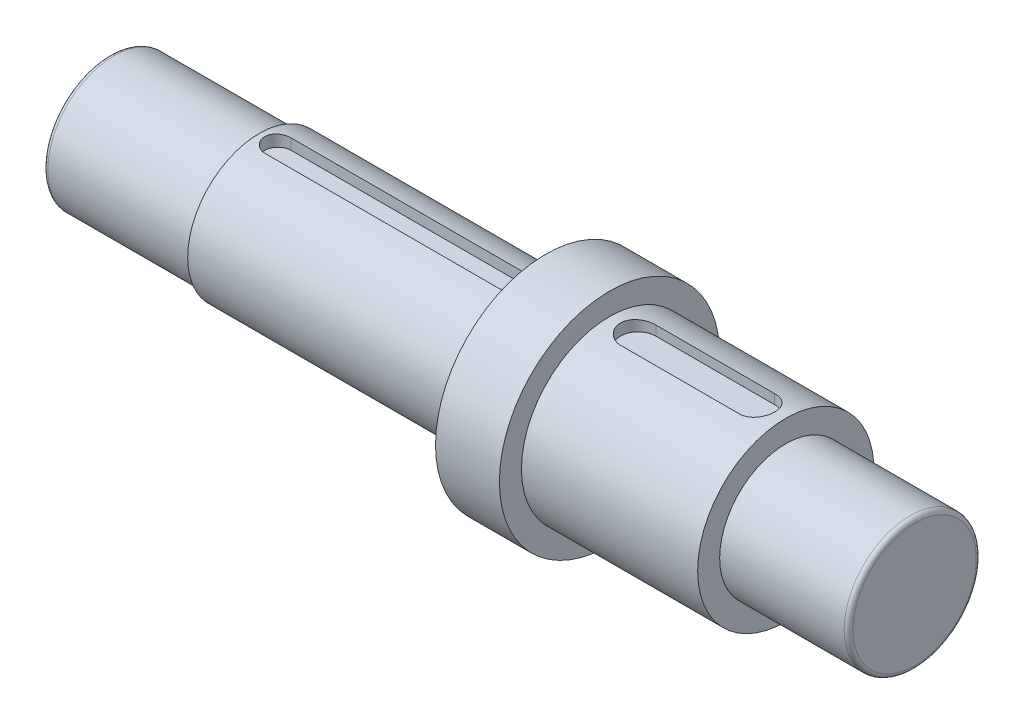
ISO-10303-21;
HEADER;
FILE_DESCRIPTION(('STEP AP214'),'2;1');
FILE_NAME('part.step','',(''),(''),'','','');
FILE_SCHEMA(('AUTOMOTIVE_DESIGN { 1 0 10303 214 1 1 1 1 }'));
ENDSEC;
DATA;
#1=APPLICATION_CONTEXT('core data for automotive mechanical design processes');
#2=APPLICATION_PROTOCOL_DEFINITION('international standard','automotive_design',2000,#1);
#3=PRODUCT_CONTEXT('',#1,'mechanical');
#4=PRODUCT('Part','Part','',(#3));
#5=PRODUCT_RELATED_PRODUCT_CATEGORY('part','',(#4));
#6=PRODUCT_DEFINITION_FORMATION('','',#4);
#7=PRODUCT_DEFINITION_CONTEXT('part definition',#1,'design');
#8=PRODUCT_DEFINITION('design','',#6,#7);
#9=PRODUCT_DEFINITION_SHAPE('','',#8);
#10=(LENGTH_UNIT() NAMED_UNIT(*) SI_UNIT(.MILLI.,.METRE.));
#11=(NAMED_UNIT(*) PLANE_ANGLE_UNIT() SI_UNIT($,.RADIAN.));
#12=(NAMED_UNIT(*) SI_UNIT($,.STERADIAN.) SOLID_ANGLE_UNIT());
#13=UNCERTAINTY_MEASURE_WITH_UNIT(LENGTH_MEASURE(1.E-05),#10,'distance_accuracy_value','');
#14=(GEOMETRIC_REPRESENTATION_CONTEXT(3) GLOBAL_UNCERTAINTY_ASSIGNED_CONTEXT((#13)) GLOBAL_UNIT_ASSIGNED_CONTEXT((#10,
#11,#12)) REPRESENTATION_CONTEXT('',''));
#15=CARTESIAN_POINT('',(0.,0.,0.));
#16=DIRECTION('',(0.,0.,1.));
#17=DIRECTION('',(1.,0.,0.));
#18=AXIS2_PLACEMENT_3D('',#15,#16,#17);
#19=CARTESIAN_POINT('',(-188.099626111809,0.,0.));
#20=DIRECTION('',(1.,0.,0.));
#21=DIRECTION('',(0.,0.,-1.));
#22=AXIS2_PLACEMENT_3D('',#19,#20,#21);
#23=PLANE('',#22);
#24=CARTESIAN_POINT('',(-188.099626111809,0.,0.));
#25=DIRECTION('',(1.,0.,0.));
#26=DIRECTION('',(0.,0.,-1.));
#27=AXIS2_PLACEMENT_3D('',#24,#25,#26);
#28=CIRCLE('',#27,28.);
#29=CARTESIAN_POINT('',(-188.099626111809,0.,-28.));
#30=VERTEX_POINT('',#29);
#31=EDGE_CURVE('E186',#30,#30,#28,.F.);
#32=ORIENTED_EDGE('',*,*,#31,.T.);
#33=EDGE_LOOP('',(#32));
#34=FACE_BOUND('',#33,.T.);
#35=ADVANCED_FACE('F37',(#34),#23,.F.);
#36=CARTESIAN_POINT('',(-188.099626111809,0.,0.));
#37=DIRECTION('',(-1.,0.,0.));
#38=DIRECTION('',(0.,0.,1.));
#39=AXIS2_PLACEMENT_3D('',#36,#37,#38);
#40=CYLINDRICAL_SURFACE('',#39,30.);
#41=CARTESIAN_POINT('',(-186.099626111809,0.,0.));
#42=DIRECTION('',(1.,0.,0.));
#43=DIRECTION('',(0.,0.,-1.));
#44=AXIS2_PLACEMENT_3D('',#41,#42,#43);
#45=CIRCLE('',#44,30.);
#46=CARTESIAN_POINT('',(-186.099626111809,0.,-30.));
#47=VERTEX_POINT('',#46);
#48=EDGE_CURVE('E189',#47,#47,#45,.T.);
#49=ORIENTED_EDGE('',*,*,#48,.T.);
#50=EDGE_LOOP('',(#49));
#51=FACE_BOUND('',#50,.T.);
#52=CARTESIAN_POINT('',(-120.099626111809,0.,0.));
#53=DIRECTION('',(-1.,0.,0.));
#54=DIRECTION('',(0.,0.,1.));
#55=AXIS2_PLACEMENT_3D('',#52,#53,#54);
#56=CIRCLE('',#55,30.);
#57=CARTESIAN_POINT('',(-120.099626111809,0.,30.));
#58=VERTEX_POINT('',#57);
#59=EDGE_CURVE('E177',#58,#58,#56,.T.);
#60=ORIENTED_EDGE('',*,*,#59,.T.);
#61=EDGE_LOOP('',(#60));
#62=FACE_BOUND('',#61,.T.);
#63=ADVANCED_FACE('F271',(#51,#62),#40,.T.);
#64=CARTESIAN_POINT('',(-120.099626111809,30.,0.));
#65=DIRECTION('',(1.,0.,0.));
#66=DIRECTION('',(0.,0.,-1.));
#67=AXIS2_PLACEMENT_3D('',#64,#65,#66);
#68=PLANE('',#67);
#69=ORIENTED_EDGE('',*,*,#59,.F.);
#70=EDGE_LOOP('',(#69));
#71=FACE_BOUND('',#70,.T.);
#72=CARTESIAN_POINT('',(-120.099626111809,0.,0.));
#73=DIRECTION('',(-1.,0.,0.));
#74=DIRECTION('',(0.,0.,1.));
#75=AXIS2_PLACEMENT_3D('',#72,#73,#74);
#76=CIRCLE('',#75,32.5);
#77=CARTESIAN_POINT('',(-120.099626111809,0.,32.5));
#78=VERTEX_POINT('',#77);
#79=EDGE_CURVE('E174',#78,#78,#76,.T.);
#80=ORIENTED_EDGE('',*,*,#79,.T.);
#81=EDGE_LOOP('',(#80));
#82=FACE_BOUND('',#81,.T.);
#83=ADVANCED_FACE('F277',(#71,#82),#68,.F.);
#84=CARTESIAN_POINT('',(-188.099626111809,0.,0.));
#85=DIRECTION('',(-1.,0.,0.));
#86=DIRECTION('',(0.,0.,1.));
#87=AXIS2_PLACEMENT_3D('',#84,#85,#86);
#88=CYLINDRICAL_SURFACE('',#87,32.5);
#89=DIRECTION('',(-1.,0.,0.));
#90=VECTOR('',#89,1.);
#91=CARTESIAN_POINT('',(-188.099626111809,31.9413525073689,-5.99999999999999));
#92=LINE('',#91,#90);
#93=CARTESIAN_POINT('',(-111.599626111809,31.9413525073689,-6.));
#94=VERTEX_POINT('',#93);
#95=CARTESIAN_POINT('',(1.40037388819075,31.9413525073689,-6.00000000000002));
#96=VERTEX_POINT('',#95);
#97=EDGE_CURVE('E457',#94,#96,#92,.F.);
#98=ORIENTED_EDGE('',*,*,#97,.T.);
#99=CARTESIAN_POINT('',(1.40037388819075,31.9413525073689,-6.00000000000002));
#100=CARTESIAN_POINT('',(1.56759213231855,31.9413387857947,-6.00001972804652));
#101=CARTESIAN_POINT('',(1.73480558941149,31.9426651643651,-5.99301037323591));
#102=CARTESIAN_POINT('',(2.06800747164038,31.947898574465,-5.96507748310398));
#103=CARTESIAN_POINT('',(2.23399603214048,31.951805316384,-5.94415550928303));
#104=CARTESIAN_POINT('',(2.56334009336544,31.9620927431616,-5.88858022552663));
#105=CARTESIAN_POINT('',(2.7266989541724,31.9684699578331,-5.85394617497413));
#106=CARTESIAN_POINT('',(3.04986439900829,31.9835079502799,-5.77122142179093));
#107=CARTESIAN_POINT('',(3.20967097733182,31.9921687317226,-5.72313069754892));
#108=CARTESIAN_POINT('',(3.52460885764031,32.0115239309396,-5.613858565212));
#109=CARTESIAN_POINT('',(3.67974033220621,32.0222182735384,-5.55267764101733));
#110=CARTESIAN_POINT('',(3.98432419858108,32.0453386476662,-5.41765280752468));
#111=CARTESIAN_POINT('',(4.13377446503129,32.0577653193071,-5.34380421506815));
#112=CARTESIAN_POINT('',(4.42587516859815,32.0839913654135,-5.18401841837622));
#113=CARTESIAN_POINT('',(4.56852780210195,32.0977902919789,-5.09808515477472));
#114=CARTESIAN_POINT('',(4.8461828974599,32.126383548917,-4.91468141870756));
#115=CARTESIAN_POINT('',(4.98118247998666,32.1411782494131,-4.81720664599407));
#116=CARTESIAN_POINT('',(5.24392898237313,32.1715045920759,-4.61035013215917));
#117=CARTESIAN_POINT('',(5.37158655490806,32.187042269054,-4.50085577213908));
#118=CARTESIAN_POINT('',(5.61729887855691,32.2182804790527,-4.27151002693492));
#119=CARTESIAN_POINT('',(5.73535005481028,32.2339810702705,-4.15165482004203));
#120=CARTESIAN_POINT('',(5.96096793099421,32.2650977553358,-3.90246404243752));
#121=CARTESIAN_POINT('',(6.06853684956549,32.280513908824,-3.7731304880801));
#122=CARTESIAN_POINT('',(6.27251215524249,32.3106414262999,-3.5057878707629));
#123=CARTESIAN_POINT('',(6.36891441281453,32.3253525283815,-3.36777562727));
#124=CARTESIAN_POINT('',(6.5504650990012,32.3537531221654,-3.08306099946315));
#125=CARTESIAN_POINT('',(6.63552987160601,32.3674347266048,-2.93630446341508));
#126=CARTESIAN_POINT('',(6.79300860896687,32.39327817288,-2.63595403307195));
#127=CARTESIAN_POINT('',(6.86541783889764,32.4054394454306,-2.48235760661727));
#128=CARTESIAN_POINT('',(6.99696891054346,32.4278842146267,-2.16953912880617));
#129=CARTESIAN_POINT('',(7.05611720991966,32.43816862479,-2.01031985951637));
#130=CARTESIAN_POINT('',(7.16075325084535,32.4565758245332,-1.68726622579658));
#131=CARTESIAN_POINT('',(7.20623603337107,32.4646978292852,-1.52343020954716));
#132=CARTESIAN_POINT('',(7.28271109315313,32.4784619635949,-1.19428937290305));
#133=CARTESIAN_POINT('',(7.31386333895041,32.4841314254946,-1.02902285551303));
#134=CARTESIAN_POINT('',(7.36219292388392,32.4929641670952,-0.696389660835734));
#135=CARTESIAN_POINT('',(7.37937013108371,32.4961274231355,-0.529022963736081));
#136=CARTESIAN_POINT('',(7.39961113282516,32.4998576642738,-0.193419088173538));
#137=CARTESIAN_POINT('',(7.40267573975347,32.5004247988165,-0.0251819603748304));
#138=CARTESIAN_POINT('',(7.39466906742151,32.4989470467579,0.310943540652038));
#139=CARTESIAN_POINT('',(7.38359787127174,32.4969021755137,0.478831915924853));
#140=CARTESIAN_POINT('',(7.34762918066929,32.4902991463823,0.811000792294008));
#141=CARTESIAN_POINT('',(7.32290155805706,32.4857718718836,0.975300336608155));
#142=CARTESIAN_POINT('',(7.25993171293172,32.4743508081301,1.30120167256646));
#143=CARTESIAN_POINT('',(7.22168972591755,32.4674570601131,1.46280351116897));
#144=CARTESIAN_POINT('',(7.13197359884245,32.4514913115269,1.7822145678949));
#145=CARTESIAN_POINT('',(7.08049682130815,32.4424188768056,1.94002302319778));
#146=CARTESIAN_POINT('',(6.96471953499474,32.422348706553,2.25067218859322));
#147=CARTESIAN_POINT('',(6.90042350877799,32.4113516441784,2.40351461351369));
#148=CARTESIAN_POINT('',(6.75905093295844,32.3876602669359,2.70413221736002));
#149=CARTESIAN_POINT('',(6.68190172408828,32.3749563872849,2.85187246890166));
#150=CARTESIAN_POINT('',(6.51567352140937,32.3482544525693,3.14028729035264));
#151=CARTESIAN_POINT('',(6.42659873164165,32.3342568541064,3.28096432628653));
#152=CARTESIAN_POINT('',(6.23708217455325,32.3053397564869,3.55442520770941));
#153=CARTESIAN_POINT('',(6.13663580163055,32.2904198849195,3.68720582162269));
#154=CARTESIAN_POINT('',(5.92513049171936,32.2600755738219,3.94388427294109));
#155=CARTESIAN_POINT('',(5.81407530010459,32.2446513136185,4.06778521841463));
#156=CARTESIAN_POINT('',(5.58031028946908,32.2134793446507,4.30773837389126));
#157=CARTESIAN_POINT('',(5.45744948638493,32.1977302742279,4.42364336885937));
#158=CARTESIAN_POINT('',(5.20241752114185,32.166590238664,4.64466655714655));
#159=CARTESIAN_POINT('',(5.07024973561523,32.1511991463148,4.74978862891943));
#160=CARTESIAN_POINT('',(4.79737578023074,32.1211958688334,4.94862562431094));
#161=CARTESIAN_POINT('',(4.65666403173227,32.1065842045684,5.04233297220689));
#162=CARTESIAN_POINT('',(4.36780189113093,32.0785750424357,5.21755652220306));
#163=CARTESIAN_POINT('',(4.21965434882862,32.0651770848488,5.29907734790027));
#164=CARTESIAN_POINT('',(3.9165076191391,32.0399447422428,5.44956701274568));
#165=CARTESIAN_POINT('',(3.76149178493203,32.0281144685451,5.51850301951116));
#166=CARTESIAN_POINT('',(3.44612020978507,32.0064110019808,5.64301783414206));
#167=CARTESIAN_POINT('',(3.28576657077875,31.996537049153,5.69860183057833));
#168=CARTESIAN_POINT('',(2.96098766453493,31.9790439211199,5.79596382074335));
#169=CARTESIAN_POINT('',(2.79656685590088,31.9714223859376,5.8377562699994));
#170=CARTESIAN_POINT('',(2.46475038653009,31.9586519303727,5.90726811971031));
#171=CARTESIAN_POINT('',(2.29735618621216,31.9535018291353,5.93499424144039));
#172=CARTESIAN_POINT('',(2.00814263464845,31.9469053541025,5.97038248093271));
#173=CARTESIAN_POINT('',(1.886748378074,31.9448246568417,5.98149459292175));
#174=CARTESIAN_POINT('',(1.64369783303153,31.9420477031673,5.99629903533954));
#175=CARTESIAN_POINT('',(1.52204232980331,31.9413491218277,6.00000382610285));
#176=CARTESIAN_POINT('',(1.40037388819075,31.9413525073689,5.99999999999998));
#177=B_SPLINE_CURVE_WITH_KNOTS('',3,(#99,#100,#101,#102,#103,#104,#105,#106,#107,#108,#109,#110,
#111,#112,#113,#114,#115,#116,#117,#118,#119,#120,#121,#122,#123,#124,#125,#126,#127,#128,#129,
#130,#131,#132,#133,#134,#135,#136,#137,#138,#139,#140,#141,#142,#143,#144,#145,#146,#147,#148,
#149,#150,#151,#152,#153,#154,#155,#156,#157,#158,#159,#160,#161,#162,#163,#164,#165,#166,#167,
#168,#169,#170,#171,#172,#173,#174,#175,#176),.UNSPECIFIED.,.F.,.F.,(4,2,2,2,2,2,2,2,2,2,2,2,2,
2,2,2,2,2,2,2,2,2,2,2,2,2,2,2,2,2,2,2,2,2,2,2,2,2,4),(0.,0.501495470760245,1.00293466504055,
1.50367204425039,2.00441022764532,2.50512990364768,3.00603509315042,3.50677732194079,
4.00770671273936,4.51381178473914,5.02010434213722,5.52628950547209,6.0326612671034,
6.54258387789152,7.05269685982357,7.56256089040486,8.07260972061949,8.57681791670595,
9.08103087289825,9.58521480389395,10.0893957705872,10.5874420693423,11.0854796896587,
11.5836166376146,12.0815797043902,12.5824597292727,13.0831636451031,13.5840710813185,
14.084802324456,14.5931139762335,15.1012421501453,15.6097057420663,16.1179759293311,
16.627553755771,17.1369332395351,17.6457771118129,18.1543776150577,18.5199145679153,
18.8848361083196),.UNSPECIFIED.);
#178=CARTESIAN_POINT('',(1.40037388819075,31.9413525073689,5.99999999999998));
#179=VERTEX_POINT('',#178);
#180=EDGE_CURVE('E192',#96,#179,#177,.T.);
#181=ORIENTED_EDGE('',*,*,#180,.T.);
#182=DIRECTION('',(-1.,0.,0.));
#183=VECTOR('',#182,1.);
#184=CARTESIAN_POINT('',(-188.099626111809,31.9413525073689,6.00000000000001));
#185=LINE('',#184,#183);
#186=CARTESIAN_POINT('',(-111.599626111809,31.9413525073689,6.00000000000001));
#187=VERTEX_POINT('',#186);
#188=EDGE_CURVE('E459',#179,#187,#185,.T.);
#189=ORIENTED_EDGE('',*,*,#188,.T.);
#190=CARTESIAN_POINT('',(-111.599626111809,31.9413525073689,6.));
#191=CARTESIAN_POINT('',(-111.766844355937,31.9413387857947,6.0000197280465));
#192=CARTESIAN_POINT('',(-111.93405781303,31.9426651643651,5.99301037323589));
#193=CARTESIAN_POINT('',(-112.267259695259,31.9478985744651,5.96507748310396));
#194=CARTESIAN_POINT('',(-112.433248255759,31.951805316384,5.94415550928301));
#195=CARTESIAN_POINT('',(-112.762592316984,31.9620927431616,5.88858022552661));
#196=CARTESIAN_POINT('',(-112.925951177791,31.9684699578331,5.85394617497411));
#197=CARTESIAN_POINT('',(-113.249116622627,31.9835079502799,5.77122142179091));
#198=CARTESIAN_POINT('',(-113.40892320095,31.9921687317226,5.72313069754889));
#199=CARTESIAN_POINT('',(-113.723861081259,32.0115239309396,5.61385856521198));
#200=CARTESIAN_POINT('',(-113.878992555825,32.0222182735384,5.55267764101731));
#201=CARTESIAN_POINT('',(-114.1835764222,32.0453386476662,5.41765280752466));
#202=CARTESIAN_POINT('',(-114.33302668865,32.0577653193071,5.34380421506813));
#203=CARTESIAN_POINT('',(-114.625127392217,32.0839913654135,5.18401841837619));
#204=CARTESIAN_POINT('',(-114.76778002572,32.0977902919789,5.0980851547747));
#205=CARTESIAN_POINT('',(-115.045435121078,32.126383548917,4.91468141870754));
#206=CARTESIAN_POINT('',(-115.180434703605,32.1411782494131,4.81720664599405));
#207=CARTESIAN_POINT('',(-115.443181205992,32.1715045920759,4.61035013215915));
#208=CARTESIAN_POINT('',(-115.570838778527,32.187042269054,4.50085577213906));
#209=CARTESIAN_POINT('',(-115.816551102175,32.2182804790527,4.2715100269349));
#210=CARTESIAN_POINT('',(-115.934602278429,32.2339810702705,4.15165482004201));
#211=CARTESIAN_POINT('',(-116.160220154613,32.2650977553358,3.9024640424375));
#212=CARTESIAN_POINT('',(-116.267789073184,32.280513908824,3.77313048808008));
#213=CARTESIAN_POINT('',(-116.471764378861,32.3106414262999,3.50578787076287));
#214=CARTESIAN_POINT('',(-116.568166636433,32.3253525283815,3.36777562726998));
#215=CARTESIAN_POINT('',(-116.74971732262,32.3537531221654,3.08306099946312));
#216=CARTESIAN_POINT('',(-116.834782095224,32.3674347266048,2.93630446341506));
#217=CARTESIAN_POINT('',(-116.992260832585,32.39327817288,2.63595403307193));
#218=CARTESIAN_POINT('',(-117.064670062516,32.4054394454306,2.48235760661725));
#219=CARTESIAN_POINT('',(-117.196221134162,32.4278842146267,2.16953912880615));
#220=CARTESIAN_POINT('',(-117.255369433538,32.43816862479,2.01031985951635));
#221=CARTESIAN_POINT('',(-117.360005474464,32.4565758245332,1.68726622579656));
#222=CARTESIAN_POINT('',(-117.40548825699,32.4646978292852,1.52343020954714));
#223=CARTESIAN_POINT('',(-117.481963316772,32.4784619635949,1.19428937290302));
#224=CARTESIAN_POINT('',(-117.513115562569,32.4841314254946,1.02902285551301));
#225=CARTESIAN_POINT('',(-117.561445147502,32.4929641670952,0.696389660835712));
#226=CARTESIAN_POINT('',(-117.578622354702,32.4961274231355,0.529022963736058));
#227=CARTESIAN_POINT('',(-117.598863356444,32.4998576642738,0.193419088173515));
#228=CARTESIAN_POINT('',(-117.601927963372,32.5004247988165,0.0251819603748068));
#229=CARTESIAN_POINT('',(-117.59392129104,32.4989470467579,-0.310943540652062));
#230=CARTESIAN_POINT('',(-117.58285009489,32.4969021755137,-0.478831915924877));
#231=CARTESIAN_POINT('',(-117.546881404288,32.4902991463823,-0.811000792294031));
#232=CARTESIAN_POINT('',(-117.522153781676,32.4857718718836,-0.975300336608177));
#233=CARTESIAN_POINT('',(-117.45918393655,32.4743508081301,-1.30120167256648));
#234=CARTESIAN_POINT('',(-117.420941949536,32.4674570601131,-1.46280351116899));
#235=CARTESIAN_POINT('',(-117.331225822461,32.4514913115269,-1.78221456789492));
#236=CARTESIAN_POINT('',(-117.279749044927,32.4424188768056,-1.9400230231978));
#237=CARTESIAN_POINT('',(-117.163971758613,32.422348706553,-2.25067218859324));
#238=CARTESIAN_POINT('',(-117.099675732396,32.4113516441784,-2.40351461351371));
#239=CARTESIAN_POINT('',(-116.958303156577,32.3876602669359,-2.70413221736004));
#240=CARTESIAN_POINT('',(-116.881153947707,32.3749563872849,-2.85187246890169));
#241=CARTESIAN_POINT('',(-116.714925745028,32.3482544525693,-3.14028729035266));
#242=CARTESIAN_POINT('',(-116.62585095526,32.3342568541064,-3.28096432628655));
#243=CARTESIAN_POINT('',(-116.436334398172,32.3053397564869,-3.55442520770944));
#244=CARTESIAN_POINT('',(-116.335888025249,32.2904198849195,-3.68720582162272));
#245=CARTESIAN_POINT('',(-116.124382715338,32.2600755738219,-3.94388427294112));
#246=CARTESIAN_POINT('',(-116.013327523723,32.2446513136185,-4.06778521841465));
#247=CARTESIAN_POINT('',(-115.779562513088,32.2134793446507,-4.30773837389129));
#248=CARTESIAN_POINT('',(-115.656701710003,32.1977302742279,-4.42364336885939));
#249=CARTESIAN_POINT('',(-115.40166974476,32.166590238664,-4.64466655714656));
#250=CARTESIAN_POINT('',(-115.269501959234,32.1511991463148,-4.74978862891945));
#251=CARTESIAN_POINT('',(-114.996628003849,32.1211958688334,-4.94862562431096));
#252=CARTESIAN_POINT('',(-114.855916255351,32.1065842045683,-5.04233297220692));
#253=CARTESIAN_POINT('',(-114.567054114749,32.0785750424357,-5.21755652220309));
#254=CARTESIAN_POINT('',(-114.418906572447,32.0651770848488,-5.29907734790029));
#255=CARTESIAN_POINT('',(-114.115759842758,32.0399447422428,-5.4495670127457));
#256=CARTESIAN_POINT('',(-113.960744008551,32.0281144685451,-5.51850301951117));
#257=CARTESIAN_POINT('',(-113.645372433404,32.0064110019808,-5.64301783414207));
#258=CARTESIAN_POINT('',(-113.485018794397,31.996537049153,-5.69860183057835));
#259=CARTESIAN_POINT('',(-113.160239888153,31.9790439211199,-5.79596382074337));
#260=CARTESIAN_POINT('',(-112.995819079519,31.9714223859376,-5.83775626999942));
#261=CARTESIAN_POINT('',(-112.664002610149,31.9586519303727,-5.90726811971033));
#262=CARTESIAN_POINT('',(-112.496608409831,31.9535018291353,-5.93499424144041));
#263=CARTESIAN_POINT('',(-112.207394858267,31.9469053541025,-5.97038248093273));
#264=CARTESIAN_POINT('',(-112.086000601692,31.9448246568417,-5.98149459292177));
#265=CARTESIAN_POINT('',(-111.84295005665,31.9420477031673,-5.99629903533957));
#266=CARTESIAN_POINT('',(-111.721294553422,31.9413491218277,-6.00000382610288));
#267=CARTESIAN_POINT('',(-111.599626111809,31.9413525073689,-6.));
#268=B_SPLINE_CURVE_WITH_KNOTS('',3,(#190,#191,#192,#193,#194,#195,#196,#197,#198,#199,#200,
#201,#202,#203,#204,#205,#206,#207,#208,#209,#210,#211,#212,#213,#214,#215,#216,#217,#218,#219,
#220,#221,#222,#223,#224,#225,#226,#227,#228,#229,#230,#231,#232,#233,#234,#235,#236,#237,#238,
#239,#240,#241,#242,#243,#244,#245,#246,#247,#248,#249,#250,#251,#252,#253,#254,#255,#256,#257,
#258,#259,#260,#261,#262,#263,#264,#265,#266,#267),.UNSPECIFIED.,.F.,.F.,(4,2,2,2,2,2,2,2,2,2,2,
2,2,2,2,2,2,2,2,2,2,2,2,2,2,2,2,2,2,2,2,2,2,2,2,2,2,2,4),(0.,0.501495470760242,1.00293466504055,
1.50367204425039,2.00441022764532,2.50512990364768,3.00603509315043,3.5067773219408,
4.00770671273937,4.51381178473914,5.02010434213723,5.52628950547209,6.03266126710341,
6.54258387789152,7.05269685982358,7.56256089040487,8.0726097206195,8.57681791670596,
9.08103087289826,9.58521480389396,10.0893957705872,10.5874420693423,11.0854796896587,
11.5836166376146,12.0815797043902,12.5824597292727,13.0831636451032,13.5840710813185,
14.084802324456,14.5931139762335,15.1012421501453,15.6097057420663,16.1179759293311,
16.627553755771,17.1369332395351,17.6457771118129,18.1543776150577,18.5199145679153,
18.8848361083197),.UNSPECIFIED.);
#269=EDGE_CURVE('E60',#187,#94,#268,.T.);
#270=ORIENTED_EDGE('',*,*,#269,.T.);
#271=EDGE_LOOP('',(#98,#181,#189,#270));
#272=FACE_BOUND('',#271,.T.);
#273=ORIENTED_EDGE('',*,*,#79,.F.);
#274=EDGE_LOOP('',(#273));
#275=FACE_BOUND('',#274,.T.);
#276=CARTESIAN_POINT('',(9.90037388819076,0.,0.));
#277=DIRECTION('',(-1.,0.,0.));
#278=DIRECTION('',(0.,0.,1.));
#279=AXIS2_PLACEMENT_3D('',#276,#277,#278);
#280=CIRCLE('',#279,32.5);
#281=CARTESIAN_POINT('',(9.90037388819076,0.,32.5));
#282=VERTEX_POINT('',#281);
#283=EDGE_CURVE('E171',#282,#282,#280,.T.);
#284=ORIENTED_EDGE('',*,*,#283,.T.);
#285=EDGE_LOOP('',(#284));
#286=FACE_BOUND('',#285,.T.);
#287=ADVANCED_FACE('F207',(#272,#275,#286),#88,.T.);
#288=CARTESIAN_POINT('',(9.90037388819076,32.5,0.));
#289=DIRECTION('',(1.,0.,0.));
#290=DIRECTION('',(0.,0.,-1.));
#291=AXIS2_PLACEMENT_3D('',#288,#289,#290);
#292=PLANE('',#291);
#293=ORIENTED_EDGE('',*,*,#283,.F.);
#294=EDGE_LOOP('',(#293));
#295=FACE_BOUND('',#294,.T.);
#296=CARTESIAN_POINT('',(9.90037388819076,0.,0.));
#297=DIRECTION('',(-1.,0.,0.));
#298=DIRECTION('',(0.,0.,1.));
#299=AXIS2_PLACEMENT_3D('',#296,#297,#298);
#300=CIRCLE('',#299,50.);
#301=CARTESIAN_POINT('',(9.90037388819076,0.,50.));
#302=VERTEX_POINT('',#301);
#303=EDGE_CURVE('E168',#302,#302,#300,.T.);
#304=ORIENTED_EDGE('',*,*,#303,.T.);
#305=EDGE_LOOP('',(#304));
#306=FACE_BOUND('',#305,.T.);
#307=ADVANCED_FACE('F306',(#295,#306),#292,.F.);
#308=CARTESIAN_POINT('',(-188.099626111809,0.,0.));
#309=DIRECTION('',(-1.,0.,0.));
#310=DIRECTION('',(0.,0.,1.));
#311=AXIS2_PLACEMENT_3D('',#308,#309,#310);
#312=CYLINDRICAL_SURFACE('',#311,50.);
#313=ORIENTED_EDGE('',*,*,#303,.F.);
#314=EDGE_LOOP('',(#313));
#315=FACE_BOUND('',#314,.T.);
#316=CARTESIAN_POINT('',(38.9003738881908,0.,0.));
#317=DIRECTION('',(-1.,0.,0.));
#318=DIRECTION('',(0.,0.,1.));
#319=AXIS2_PLACEMENT_3D('',#316,#317,#318);
#320=CIRCLE('',#319,50.);
#321=CARTESIAN_POINT('',(38.9003738881908,0.,50.));
#322=VERTEX_POINT('',#321);
#323=EDGE_CURVE('E165',#322,#322,#320,.T.);
#324=ORIENTED_EDGE('',*,*,#323,.T.);
#325=EDGE_LOOP('',(#324));
#326=FACE_BOUND('',#325,.T.);
#327=ADVANCED_FACE('F312',(#315,#326),#312,.T.);
#328=CARTESIAN_POINT('',(38.9003738881908,50.,0.));
#329=DIRECTION('',(-1.,0.,0.));
#330=DIRECTION('',(0.,0.,1.));
#331=AXIS2_PLACEMENT_3D('',#328,#329,#330);
#332=PLANE('',#331);
#333=ORIENTED_EDGE('',*,*,#323,.F.);
#334=EDGE_LOOP('',(#333));
#335=FACE_BOUND('',#334,.T.);
#336=CARTESIAN_POINT('',(38.9003738881908,0.,0.));
#337=DIRECTION('',(-1.,0.,0.));
#338=DIRECTION('',(0.,0.,1.));
#339=AXIS2_PLACEMENT_3D('',#336,#337,#338);
#340=CIRCLE('',#339,40.);
#341=CARTESIAN_POINT('',(38.9003738881908,0.,40.));
#342=VERTEX_POINT('',#341);
#343=EDGE_CURVE('E162',#342,#342,#340,.T.);
#344=ORIENTED_EDGE('',*,*,#343,.T.);
#345=EDGE_LOOP('',(#344));
#346=FACE_BOUND('',#345,.T.);
#347=ADVANCED_FACE('F244',(#335,#346),#332,.F.);
#348=CARTESIAN_POINT('',(-188.099626111809,0.,0.));
#349=DIRECTION('',(-1.,0.,0.));
#350=DIRECTION('',(0.,0.,1.));
#351=AXIS2_PLACEMENT_3D('',#348,#349,#350);
#352=CYLINDRICAL_SURFACE('',#351,40.);
#353=DIRECTION('',(-1.,0.,0.));
#354=VECTOR('',#353,1.);
#355=CARTESIAN_POINT('',(-188.099626111809,39.1918358845309,-7.99999999999996));
#356=LINE('',#355,#354);
#357=CARTESIAN_POINT('',(51.9003738881907,39.1918358845309,-8.00000000000001));
#358=VERTEX_POINT('',#357);
#359=CARTESIAN_POINT('',(105.900373888191,39.1918358845309,-8.00000000000002));
#360=VERTEX_POINT('',#359);
#361=EDGE_CURVE('E11',#358,#360,#356,.F.);
#362=ORIENTED_EDGE('',*,*,#361,.T.);
#363=CARTESIAN_POINT('',(105.900373888191,39.1918358845309,-8.00000000000002));
#364=CARTESIAN_POINT('',(106.122974410828,39.1918159431798,-8.00002666922674));
#365=CARTESIAN_POINT('',(106.345568032235,39.1937316873133,-7.9907103558701));
#366=CARTESIAN_POINT('',(106.789117637829,39.2012897767833,-7.95358673509779));
#367=CARTESIAN_POINT('',(107.010073821181,39.2069316611182,-7.92578171511934));
#368=CARTESIAN_POINT('',(107.448447184837,39.2217860307119,-7.8519317275118));
#369=CARTESIAN_POINT('',(107.665869233589,39.2309930760462,-7.80591454667944));
#370=CARTESIAN_POINT('',(108.095979336453,39.2527015332246,-7.69601051127466));
#371=CARTESIAN_POINT('',(108.308667371235,39.2652029585174,-7.63212358375313));
#372=CARTESIAN_POINT('',(108.72780662392,39.2931373309787,-7.4869759582795));
#373=CARTESIAN_POINT('',(108.934258426169,39.3085700024906,-7.40571689392717));
#374=CARTESIAN_POINT('',(109.339610412071,39.3419309258448,-7.2263951793695));
#375=CARTESIAN_POINT('',(109.538507768332,39.359860100561,-7.12832631202961));
#376=CARTESIAN_POINT('',(109.92728093049,39.3976973294659,-6.91614404681895));
#377=CARTESIAN_POINT('',(110.117159193655,39.4176048400293,-6.8020350530473));
#378=CARTESIAN_POINT('',(110.486761304225,39.4588545756894,-6.55850947337002));
#379=CARTESIAN_POINT('',(110.6664815319,39.4801973063558,-6.4290874809944));
#380=CARTESIAN_POINT('',(111.016674671152,39.5239924026978,-6.15415578885215));
#381=CARTESIAN_POINT('',(111.187005372329,39.5464552423725,-6.00846658612049));
#382=CARTESIAN_POINT('',(111.51483213444,39.5916124451561,-5.70333270732976));
#383=CARTESIAN_POINT('',(111.672328108516,39.6143068098307,-5.54388793819498));
#384=CARTESIAN_POINT('',(111.973466691381,39.6593025376984,-5.21226662634086));
#385=CARTESIAN_POINT('',(112.117104880146,39.6816037736592,-5.04008605219296));
#386=CARTESIAN_POINT('',(112.389437452669,39.7251794083479,-4.68425375547296));
#387=CARTESIAN_POINT('',(112.518136678581,39.7464541384827,-4.50060577967102));
#388=CARTESIAN_POINT('',(112.760815682899,39.7875762988249,-4.12134325254239));
#389=CARTESIAN_POINT('',(112.874654240406,39.8074093383913,-3.92563673340874));
#390=CARTESIAN_POINT('',(113.085411580005,39.8448742915997,-3.52511574724934));
#391=CARTESIAN_POINT('',(113.182330603902,39.8625062366975,-3.32030141044043));
#392=CARTESIAN_POINT('',(113.358504784034,39.8950650833093,-2.90302705629159));
#393=CARTESIAN_POINT('',(113.437761802143,39.9099922699196,-2.69056784759605));
#394=CARTESIAN_POINT('',(113.578001059155,39.9367151389395,-2.25951457252051));
#395=CARTESIAN_POINT('',(113.638983945792,39.948510932341,-2.04092072388624));
#396=CARTESIAN_POINT('',(113.741517513335,39.9685005509805,-1.60205660509414));
#397=CARTESIAN_POINT('',(113.783309955072,39.9767391064403,-1.38184484347664));
#398=CARTESIAN_POINT('',(113.848269063717,39.9895989229295,-0.938668501096538));
#399=CARTESIAN_POINT('',(113.871442672396,39.9942215320969,-0.715704977800327));
#400=CARTESIAN_POINT('',(113.899002944583,39.9997235457757,-0.268546453942596));
#401=CARTESIAN_POINT('',(113.903387327323,40.0006024958556,-0.0443513071851616));
#402=CARTESIAN_POINT('',(113.893326869244,39.9985908858011,0.403598136420499));
#403=CARTESIAN_POINT('',(113.878882175075,39.9957003550254,0.627352436688695));
#404=CARTESIAN_POINT('',(113.83162661832,39.9863007164749,1.06956087762929));
#405=CARTESIAN_POINT('',(113.79908413002,39.9798444941963,1.28804488719501));
#406=CARTESIAN_POINT('',(113.71606699332,39.9635259160648,1.72152774938214));
#407=CARTESIAN_POINT('',(113.665586125328,39.9536623788616,1.93652536613345));
#408=CARTESIAN_POINT('',(113.547103395042,39.9308038729487,2.36138711377733));
#409=CARTESIAN_POINT('',(113.479107359111,39.9178099456462,2.57125292637827));
#410=CARTESIAN_POINT('',(113.326071063526,39.8890377494063,2.98456033438453));
#411=CARTESIAN_POINT('',(113.241024781951,39.8732584969652,3.18799963056056));
#412=CARTESIAN_POINT('',(113.05395294381,39.839241787259,3.58823088504011));
#413=CARTESIAN_POINT('',(112.951826488758,39.8209898525272,3.7849744440591));
#414=CARTESIAN_POINT('',(112.731697190893,39.7825996820114,4.16917750443026));
#415=CARTESIAN_POINT('',(112.613694105933,39.762461417459,4.35663686412196));
#416=CARTESIAN_POINT('',(112.362608486233,39.7208402552587,4.72106963579888));
#417=CARTESIAN_POINT('',(112.229522696929,39.6993570678511,4.89804077202867));
#418=CARTESIAN_POINT('',(111.949241007284,39.6556382273803,5.24023924452891));
#419=CARTESIAN_POINT('',(111.802049410858,39.6334028051675,5.4054701363154));
#420=CARTESIAN_POINT('',(111.491806671275,39.5883841709058,5.72594829962103));
#421=CARTESIAN_POINT('',(111.32852301432,39.5655981831912,5.88097018343542));
#422=CARTESIAN_POINT('',(110.989439256982,39.52050553126,6.17673271835418));
#423=CARTESIAN_POINT('',(110.813639298877,39.4981988615986,6.31747353175152));
#424=CARTESIAN_POINT('',(110.450656030673,39.4546904604362,6.58373833819255));
#425=CARTESIAN_POINT('',(110.263469251054,39.4334890694003,6.70925765808143));
#426=CARTESIAN_POINT('',(109.879041254413,39.3928073388215,6.94413000109325));
#427=CARTESIAN_POINT('',(109.681800307801,39.3733269530302,7.05348345869363));
#428=CARTESIAN_POINT('',(109.278027519462,39.3365988941848,7.25551976501701));
#429=CARTESIAN_POINT('',(109.071470170284,39.319357923992,7.34815287597922));
#430=CARTESIAN_POINT('',(108.651140916193,39.287693064182,7.51561296401807));
#431=CARTESIAN_POINT('',(108.437371866988,39.2732680744914,7.59044689691487));
#432=CARTESIAN_POINT('',(108.004309491692,39.2476734918111,7.72169650413227));
#433=CARTESIAN_POINT('',(107.78502218219,39.2365005071337,7.77813137524139));
#434=CARTESIAN_POINT('',(107.342393842191,39.217732786038,7.8722129784336));
#435=CARTESIAN_POINT('',(107.119054791977,39.2101363480467,7.90986864539155));
#436=CARTESIAN_POINT('',(106.729559165192,39.200259679954,7.95864886653906));
#437=CARTESIAN_POINT('',(106.563960659121,39.1971035385051,7.97416273216955));
#438=CARTESIAN_POINT('',(106.232371119318,39.192890643088,7.99483261811853));
#439=CARTESIAN_POINT('',(106.066381210279,39.1918303757664,8.00000597259349));
#440=CARTESIAN_POINT('',(105.900373888191,39.1918358845309,8.));
#441=B_SPLINE_CURVE_WITH_KNOTS('',3,(#363,#364,#365,#366,#367,#368,#369,#370,#371,#372,#373,
#374,#375,#376,#377,#378,#379,#380,#381,#382,#383,#384,#385,#386,#387,#388,#389,#390,#391,#392,
#393,#394,#395,#396,#397,#398,#399,#400,#401,#402,#403,#404,#405,#406,#407,#408,#409,#410,#411,
#412,#413,#414,#415,#416,#417,#418,#419,#420,#421,#422,#423,#424,#425,#426,#427,#428,#429,#430,
#431,#432,#433,#434,#435,#436,#437,#438,#439,#440),.UNSPECIFIED.,.F.,.F.,(4,2,2,2,2,2,2,2,2,2,2,
2,2,2,2,2,2,2,2,2,2,2,2,2,2,2,2,2,2,2,2,2,2,2,2,2,2,2,4),(0.,0.667588082863367,1.33509358657229,
2.00158456075833,2.66807825577954,3.33450930419423,4.00118736722491,4.66768273830518,
5.33441413112674,6.00940860933878,6.68440765519395,7.35962128919453,8.03461545192921,
8.71561799719686,9.39661080912297,10.0775317988518,10.7584286501499,11.4304948903323,
12.1023104435849,12.7742075441763,13.4460994116818,14.1082836198391,14.7706976447377,
15.4328916036424,16.0953198539647,16.7618092594034,17.4283088311615,18.09495249579,
18.761393400153,19.439500080017,20.1175990528766,20.7959056848449,21.4741940831725,
22.1544680675849,22.8344757662839,23.5137716866303,24.1927440986814,24.6914848131909,
25.1893887678566),.UNSPECIFIED.);
#442=CARTESIAN_POINT('',(105.900373888191,39.1918358845308,8.));
#443=VERTEX_POINT('',#442);
#444=EDGE_CURVE('E249',#360,#443,#441,.T.);
#445=ORIENTED_EDGE('',*,*,#444,.T.);
#446=DIRECTION('',(-1.,0.,0.));
#447=VECTOR('',#446,1.);
#448=CARTESIAN_POINT('',(-188.099626111809,39.1918358845308,8.00000000000006));
#449=LINE('',#448,#447);
#450=CARTESIAN_POINT('',(51.9003738881907,39.1918358845308,8.00000000000006));
#451=VERTEX_POINT('',#450);
#452=EDGE_CURVE('E45',#443,#451,#449,.T.);
#453=ORIENTED_EDGE('',*,*,#452,.T.);
#454=CARTESIAN_POINT('',(51.9003738881907,39.1918358845309,8.00000000000001));
#455=CARTESIAN_POINT('',(51.6777733655539,39.1918159431797,8.00002666922673));
#456=CARTESIAN_POINT('',(51.4551797441462,39.1937316873133,7.99071035587009));
#457=CARTESIAN_POINT('',(51.0116301385526,39.2012897767833,7.95358673509778));
#458=CARTESIAN_POINT('',(50.7906739552005,39.2069316611182,7.92578171511933));
#459=CARTESIAN_POINT('',(50.3523005915448,39.2217860307119,7.85193172751178));
#460=CARTESIAN_POINT('',(50.1348785427924,39.2309930760462,7.80591454667943));
#461=CARTESIAN_POINT('',(49.7047684399284,39.2527015332246,7.69601051127465));
#462=CARTESIAN_POINT('',(49.4920804051461,39.2652029585174,7.63212358375312));
#463=CARTESIAN_POINT('',(49.0729411524612,39.2931373309787,7.48697595827949));
#464=CARTESIAN_POINT('',(48.8664893502125,39.3085700024906,7.40571689392716));
#465=CARTESIAN_POINT('',(48.4611373643103,39.3419309258448,7.2263951793695));
#466=CARTESIAN_POINT('',(48.2622400080494,39.359860100561,7.1283263120296));
#467=CARTESIAN_POINT('',(47.8734668458918,39.3976973294659,6.91614404681895));
#468=CARTESIAN_POINT('',(47.6835885827265,39.4176048400293,6.8020350530473));
#469=CARTESIAN_POINT('',(47.3139864721564,39.4588545756894,6.55850947337001));
#470=CARTESIAN_POINT('',(47.1342662444813,39.4801973063558,6.42908748099439));
#471=CARTESIAN_POINT('',(46.7840731052291,39.5239924026978,6.15415578885214));
#472=CARTESIAN_POINT('',(46.6137424040529,39.5464552423725,6.00846658612048));
#473=CARTESIAN_POINT('',(46.2859156419415,39.5916124451561,5.70333270732975));
#474=CARTESIAN_POINT('',(46.1284196678654,39.6143068098307,5.54388793819497));
#475=CARTESIAN_POINT('',(45.827281085,39.6593025376984,5.21226662634085));
#476=CARTESIAN_POINT('',(45.6836428962353,39.6816037736592,5.04008605219294));
#477=CARTESIAN_POINT('',(45.4113103237129,39.7251794083479,4.68425375547294));
#478=CARTESIAN_POINT('',(45.2826110978002,39.7464541384827,4.500605779671));
#479=CARTESIAN_POINT('',(45.0399320934821,39.7875762988249,4.12134325254238));
#480=CARTESIAN_POINT('',(44.926093535975,39.8074093383913,3.92563673340873));
#481=CARTESIAN_POINT('',(44.7153361963764,39.8448742915997,3.52511574724933));
#482=CARTESIAN_POINT('',(44.6184171724793,39.8625062366975,3.32030141044042));
#483=CARTESIAN_POINT('',(44.4422429923478,39.8950650833092,2.90302705629158));
#484=CARTESIAN_POINT('',(44.3629859742381,39.9099922699196,2.69056784759604));
#485=CARTESIAN_POINT('',(44.2227467172268,39.9367151389395,2.2595145725205));
#486=CARTESIAN_POINT('',(44.1617638305896,39.948510932341,2.04092072388623));
#487=CARTESIAN_POINT('',(44.0592302630464,39.9685005509806,1.60205660509413));
#488=CARTESIAN_POINT('',(44.0174378213094,39.9767391064403,1.38184484347663));
#489=CARTESIAN_POINT('',(43.9524787126649,39.9895989229295,0.93866850109653));
#490=CARTESIAN_POINT('',(43.9293051039857,39.9942215320969,0.715704977800318));
#491=CARTESIAN_POINT('',(43.9017448317988,39.9997235457757,0.268546453942585));
#492=CARTESIAN_POINT('',(43.8973604490581,40.0006024958556,0.044351307185151));
#493=CARTESIAN_POINT('',(43.9074209071379,39.9985908858011,-0.40359813642051));
#494=CARTESIAN_POINT('',(43.9218656013068,39.9957003550254,-0.627352436688707));
#495=CARTESIAN_POINT('',(43.9691211580613,39.9863007164749,-1.0695608776293));
#496=CARTESIAN_POINT('',(44.0016636463615,39.9798444941963,-1.28804488719502));
#497=CARTESIAN_POINT('',(44.0846807830618,39.9635259160648,-1.72152774938216));
#498=CARTESIAN_POINT('',(44.1351616510532,39.9536623788616,-1.93652536613346));
#499=CARTESIAN_POINT('',(44.2536443813396,39.9308038729487,-2.36138711377734));
#500=CARTESIAN_POINT('',(44.3216404172701,39.9178099456462,-2.57125292637828));
#501=CARTESIAN_POINT('',(44.4746767128556,39.8890377494063,-2.98456033438454));
#502=CARTESIAN_POINT('',(44.5597229944304,39.8732584969652,-3.18799963056057));
#503=CARTESIAN_POINT('',(44.7467948325716,39.839241787259,-3.58823088504013));
#504=CARTESIAN_POINT('',(44.8489212876238,39.8209898525272,-3.78497444405911));
#505=CARTESIAN_POINT('',(45.0690505854884,39.7825996820114,-4.16917750443027));
#506=CARTESIAN_POINT('',(45.187053670448,39.7624614174589,-4.35663686412197));
#507=CARTESIAN_POINT('',(45.4381392901485,39.7208402552587,-4.7210696357989));
#508=CARTESIAN_POINT('',(45.5712250794528,39.6993570678511,-4.89804077202868));
#509=CARTESIAN_POINT('',(45.8515067690975,39.6556382273803,-5.24023924452892));
#510=CARTESIAN_POINT('',(45.9986983655234,39.6334028051675,-5.40547013631541));
#511=CARTESIAN_POINT('',(46.3089411051062,39.5883841709058,-5.72594829962105));
#512=CARTESIAN_POINT('',(46.4722247620619,39.5655981831912,-5.88097018343544));
#513=CARTESIAN_POINT('',(46.8113085193991,39.52050553126,-6.1767327183542));
#514=CARTESIAN_POINT('',(46.9871084775043,39.4981988615986,-6.31747353175154));
#515=CARTESIAN_POINT('',(47.350091745709,39.4546904604362,-6.58373833819256));
#516=CARTESIAN_POINT('',(47.5372785253272,39.4334890694003,-6.70925765808145));
#517=CARTESIAN_POINT('',(47.9217065219681,39.3928073388215,-6.94413000109327));
#518=CARTESIAN_POINT('',(48.1189474685808,39.3733269530302,-7.05348345869364));
#519=CARTESIAN_POINT('',(48.5227202569196,39.3365988941848,-7.25551976501703));
#520=CARTESIAN_POINT('',(48.7292776060977,39.319357923992,-7.34815287597924));
#521=CARTESIAN_POINT('',(49.1496068601886,39.287693064182,-7.51561296401809));
#522=CARTESIAN_POINT('',(49.3633759093938,39.2732680744914,-7.59044689691488));
#523=CARTESIAN_POINT('',(49.7964382846891,39.2476734918111,-7.72169650413228));
#524=CARTESIAN_POINT('',(50.0157255941918,39.2365005071337,-7.7781313752414));
#525=CARTESIAN_POINT('',(50.4583539341903,39.217732786038,-7.87221297843362));
#526=CARTESIAN_POINT('',(50.6816929844041,39.2101363480467,-7.90986864539156));
#527=CARTESIAN_POINT('',(51.0711886111893,39.200259679954,-7.95864886653907));
#528=CARTESIAN_POINT('',(51.2367871172606,39.1971035385051,-7.97416273216956));
#529=CARTESIAN_POINT('',(51.5683766570638,39.192890643088,-7.99483261811854));
#530=CARTESIAN_POINT('',(51.7343665661027,39.1918303757664,-8.0000059725935));
#531=CARTESIAN_POINT('',(51.9003738881907,39.1918358845309,-8.00000000000001));
#532=B_SPLINE_CURVE_WITH_KNOTS('',3,(#454,#455,#456,#457,#458,#459,#460,#461,#462,#463,#464,
#465,#466,#467,#468,#469,#470,#471,#472,#473,#474,#475,#476,#477,#478,#479,#480,#481,#482,#483,
#484,#485,#486,#487,#488,#489,#490,#491,#492,#493,#494,#495,#496,#497,#498,#499,#500,#501,#502,
#503,#504,#505,#506,#507,#508,#509,#510,#511,#512,#513,#514,#515,#516,#517,#518,#519,#520,#521,
#522,#523,#524,#525,#526,#527,#528,#529,#530,#531),.UNSPECIFIED.,.F.,.F.,(4,2,2,2,2,2,2,2,2,2,2,
2,2,2,2,2,2,2,2,2,2,2,2,2,2,2,2,2,2,2,2,2,2,2,2,2,2,2,4),(0.,0.667588082863367,1.33509358657229,
2.00158456075835,2.66807825577954,3.33450930419421,4.0011873672249,4.66768273830516,
5.33441413112675,6.00940860933878,6.68440765519396,7.35962128919453,8.03461545192922,
8.71561799719686,9.39661080912297,10.0775317988518,10.7584286501499,11.4304948903323,
12.1023104435849,12.7742075441763,13.4460994116818,14.1082836198391,14.7706976447377,
15.4328916036424,16.0953198539647,16.7618092594034,17.4283088311615,18.09495249579,
18.761393400153,19.439500080017,20.1175990528766,20.7959056848449,21.4741940831725,
22.1544680675849,22.8344757662839,23.5137716866303,24.1927440986814,24.691484813191,
25.1893887678566),.UNSPECIFIED.);
#533=EDGE_CURVE('E52',#451,#358,#532,.T.);
#534=ORIENTED_EDGE('',*,*,#533,.T.);
#535=EDGE_LOOP('',(#362,#445,#453,#534));
#536=FACE_BOUND('',#535,.T.);
#537=ORIENTED_EDGE('',*,*,#343,.F.);
#538=EDGE_LOOP('',(#537));
#539=FACE_BOUND('',#538,.T.);
#540=CARTESIAN_POINT('',(118.900373888191,0.,0.));
#541=DIRECTION('',(-1.,0.,0.));
#542=DIRECTION('',(0.,0.,1.));
#543=AXIS2_PLACEMENT_3D('',#540,#541,#542);
#544=CIRCLE('',#543,40.);
#545=CARTESIAN_POINT('',(118.900373888191,0.,40.));
#546=VERTEX_POINT('',#545);
#547=EDGE_CURVE('E159',#546,#546,#544,.T.);
#548=ORIENTED_EDGE('',*,*,#547,.T.);
#549=EDGE_LOOP('',(#548));
#550=FACE_BOUND('',#549,.T.);
#551=ADVANCED_FACE('F239',(#536,#539,#550),#352,.T.);
#552=CARTESIAN_POINT('',(118.900373888191,40.,0.));
#553=DIRECTION('',(-1.,0.,0.));
#554=DIRECTION('',(0.,0.,1.));
#555=AXIS2_PLACEMENT_3D('',#552,#553,#554);
#556=PLANE('',#555);
#557=ORIENTED_EDGE('',*,*,#547,.F.);
#558=EDGE_LOOP('',(#557));
#559=FACE_BOUND('',#558,.T.);
#560=CARTESIAN_POINT('',(118.900373888191,0.,0.));
#561=DIRECTION('',(-1.,0.,0.));
#562=DIRECTION('',(0.,0.,1.));
#563=AXIS2_PLACEMENT_3D('',#560,#561,#562);
#564=CIRCLE('',#563,30.);
#565=CARTESIAN_POINT('',(118.900373888191,0.,30.));
#566=VERTEX_POINT('',#565);
#567=EDGE_CURVE('E149',#566,#566,#564,.T.);
#568=ORIENTED_EDGE('',*,*,#567,.T.);
#569=EDGE_LOOP('',(#568));
#570=FACE_BOUND('',#569,.T.);
#571=ADVANCED_FACE('F235',(#559,#570),#556,.F.);
#572=CARTESIAN_POINT('',(-188.099626111809,0.,0.));
#573=DIRECTION('',(-1.,0.,0.));
#574=DIRECTION('',(0.,0.,1.));
#575=AXIS2_PLACEMENT_3D('',#572,#573,#574);
#576=CYLINDRICAL_SURFACE('',#575,30.);
#577=CARTESIAN_POINT('',(175.400373888191,0.,0.));
#578=DIRECTION('',(-1.,0.,0.));
#579=DIRECTION('',(0.,0.,1.));
#580=AXIS2_PLACEMENT_3D('',#577,#578,#579);
#581=CIRCLE('',#580,30.);
#582=CARTESIAN_POINT('',(175.400373888191,0.,30.));
#583=VERTEX_POINT('',#582);
#584=EDGE_CURVE('E180',#583,#583,#581,.T.);
#585=ORIENTED_EDGE('',*,*,#584,.T.);
#586=EDGE_LOOP('',(#585));
#587=FACE_BOUND('',#586,.T.);
#588=ORIENTED_EDGE('',*,*,#567,.F.);
#589=EDGE_LOOP('',(#588));
#590=FACE_BOUND('',#589,.T.);
#591=ADVANCED_FACE('F231',(#587,#590),#576,.T.);
#592=CARTESIAN_POINT('',(177.400373888191,30.,0.));
#593=DIRECTION('',(-1.,0.,0.));
#594=DIRECTION('',(0.,0.,1.));
#595=AXIS2_PLACEMENT_3D('',#592,#593,#594);
#596=PLANE('',#595);
#597=CARTESIAN_POINT('',(177.400373888191,0.,0.));
#598=DIRECTION('',(-1.,0.,0.));
#599=DIRECTION('',(0.,0.,1.));
#600=AXIS2_PLACEMENT_3D('',#597,#598,#599);
#601=CIRCLE('',#600,28.);
#602=CARTESIAN_POINT('',(177.400373888191,0.,28.));
#603=VERTEX_POINT('',#602);
#604=EDGE_CURVE('E183',#603,#603,#601,.F.);
#605=ORIENTED_EDGE('',*,*,#604,.T.);
#606=EDGE_LOOP('',(#605));
#607=FACE_BOUND('',#606,.T.);
#608=ADVANCED_FACE('F227',(#607),#596,.F.);
#609=CARTESIAN_POINT('',(175.400373888191,0.,0.));
#610=DIRECTION('',(-1.,0.,0.));
#611=DIRECTION('',(0.,0.,1.));
#612=AXIS2_PLACEMENT_3D('',#609,#610,#611);
#613=TOROIDAL_SURFACE('',#612,28.,2.);
#614=ORIENTED_EDGE('',*,*,#604,.F.);
#615=EDGE_LOOP('',(#614));
#616=FACE_BOUND('',#615,.T.);
#617=ORIENTED_EDGE('',*,*,#584,.F.);
#618=EDGE_LOOP('',(#617));
#619=FACE_BOUND('',#618,.T.);
#620=ADVANCED_FACE('F230',(#616,#619),#613,.T.);
#621=CARTESIAN_POINT('',(-186.099626111809,0.,0.));
#622=DIRECTION('',(1.,0.,0.));
#623=DIRECTION('',(0.,0.,-1.));
#624=AXIS2_PLACEMENT_3D('',#621,#622,#623);
#625=TOROIDAL_SURFACE('',#624,28.,2.);
#626=ORIENTED_EDGE('',*,*,#48,.F.);
#627=EDGE_LOOP('',(#626));
#628=FACE_BOUND('',#627,.T.);
#629=ORIENTED_EDGE('',*,*,#31,.F.);
#630=EDGE_LOOP('',(#629));
#631=FACE_BOUND('',#630,.T.);
#632=ADVANCED_FACE('F39',(#628,#631),#625,.T.);
#633=CARTESIAN_POINT('',(-111.599626111809,27.06,0.));
#634=DIRECTION('',(0.,1.,0.));
#635=DIRECTION('',(0.,0.,1.));
#636=AXIS2_PLACEMENT_3D('',#633,#634,#635);
#637=CYLINDRICAL_SURFACE('',#636,6.);
#638=DIRECTION('',(0.,1.,0.));
#639=VECTOR('',#638,1.);
#640=CARTESIAN_POINT('',(-111.599626111809,27.06,6.));
#641=LINE('',#640,#639);
#642=CARTESIAN_POINT('',(-111.599626111809,27.06,6.));
#643=VERTEX_POINT('',#642);
#644=EDGE_CURVE('E146',#643,#187,#641,.T.);
#645=ORIENTED_EDGE('',*,*,#644,.F.);
#646=CARTESIAN_POINT('',(-111.599626111809,27.06,0.));
#647=DIRECTION('',(0.,1.,0.));
#648=DIRECTION('',(0.,0.,1.));
#649=AXIS2_PLACEMENT_3D('',#646,#647,#648);
#650=CIRCLE('',#649,6.);
#651=CARTESIAN_POINT('',(-111.599626111809,27.06,-6.));
#652=VERTEX_POINT('',#651);
#653=EDGE_CURVE('E130',#652,#643,#650,.T.);
#654=ORIENTED_EDGE('',*,*,#653,.F.);
#655=DIRECTION('',(0.,1.,0.));
#656=VECTOR('',#655,1.);
#657=CARTESIAN_POINT('',(-111.599626111809,27.06,-6.));
#658=LINE('',#657,#656);
#659=EDGE_CURVE('E147',#652,#94,#658,.T.);
#660=ORIENTED_EDGE('',*,*,#659,.T.);
#661=ORIENTED_EDGE('',*,*,#269,.F.);
#662=EDGE_LOOP('',(#645,#654,#660,#661));
#663=FACE_BOUND('',#662,.T.);
#664=ADVANCED_FACE('F223',(#663),#637,.F.);
#665=CARTESIAN_POINT('',(-111.599626111809,27.06,-6.));
#666=DIRECTION('',(0.,0.,-1.));
#667=DIRECTION('',(-1.,0.,0.));
#668=AXIS2_PLACEMENT_3D('',#665,#666,#667);
#669=PLANE('',#668);
#670=ORIENTED_EDGE('',*,*,#659,.F.);
#671=DIRECTION('',(-1.,0.,0.));
#672=VECTOR('',#671,1.);
#673=CARTESIAN_POINT('',(-111.599626111809,27.06,-6.));
#674=LINE('',#673,#672);
#675=CARTESIAN_POINT('',(1.40037388819075,27.06,-6.00000000000002));
#676=VERTEX_POINT('',#675);
#677=EDGE_CURVE('E143',#676,#652,#674,.T.);
#678=ORIENTED_EDGE('',*,*,#677,.F.);
#679=DIRECTION('',(0.,1.,0.));
#680=VECTOR('',#679,1.);
#681=CARTESIAN_POINT('',(1.40037388819075,27.06,-6.00000000000002));
#682=LINE('',#681,#680);
#683=EDGE_CURVE('E150',#676,#96,#682,.T.);
#684=ORIENTED_EDGE('',*,*,#683,.T.);
#685=ORIENTED_EDGE('',*,*,#97,.F.);
#686=EDGE_LOOP('',(#670,#678,#684,#685));
#687=FACE_BOUND('',#686,.T.);
#688=ADVANCED_FACE('F217',(#687),#669,.F.);
#689=CARTESIAN_POINT('',(1.40037388819075,27.06,0.));
#690=DIRECTION('',(0.,1.,0.));
#691=DIRECTION('',(0.,0.,1.));
#692=AXIS2_PLACEMENT_3D('',#689,#690,#691);
#693=CYLINDRICAL_SURFACE('',#692,6.);
#694=ORIENTED_EDGE('',*,*,#683,.F.);
#695=CARTESIAN_POINT('',(1.40037388819075,27.06,0.));
#696=DIRECTION('',(0.,1.,0.));
#697=DIRECTION('',(0.,0.,1.));
#698=AXIS2_PLACEMENT_3D('',#695,#696,#697);
#699=CIRCLE('',#698,6.);
#700=CARTESIAN_POINT('',(1.40037388819075,27.06,5.99999999999998));
#701=VERTEX_POINT('',#700);
#702=EDGE_CURVE('E140',#701,#676,#699,.T.);
#703=ORIENTED_EDGE('',*,*,#702,.F.);
#704=DIRECTION('',(0.,1.,0.));
#705=VECTOR('',#704,1.);
#706=CARTESIAN_POINT('',(1.40037388819075,27.06,5.99999999999998));
#707=LINE('',#706,#705);
#708=EDGE_CURVE('E153',#701,#179,#707,.T.);
#709=ORIENTED_EDGE('',*,*,#708,.T.);
#710=ORIENTED_EDGE('',*,*,#180,.F.);
#711=EDGE_LOOP('',(#694,#703,#709,#710));
#712=FACE_BOUND('',#711,.T.);
#713=ADVANCED_FACE('F211',(#712),#693,.F.);
#714=CARTESIAN_POINT('',(-111.599626111809,27.06,6.));
#715=DIRECTION('',(0.,0.,1.));
#716=DIRECTION('',(1.,0.,0.));
#717=AXIS2_PLACEMENT_3D('',#714,#715,#716);
#718=PLANE('',#717);
#719=ORIENTED_EDGE('',*,*,#708,.F.);
#720=DIRECTION('',(1.,0.,0.));
#721=VECTOR('',#720,1.);
#722=CARTESIAN_POINT('',(-111.599626111809,27.06,6.));
#723=LINE('',#722,#721);
#724=EDGE_CURVE('E137',#643,#701,#723,.T.);
#725=ORIENTED_EDGE('',*,*,#724,.F.);
#726=ORIENTED_EDGE('',*,*,#644,.T.);
#727=ORIENTED_EDGE('',*,*,#188,.F.);
#728=EDGE_LOOP('',(#719,#725,#726,#727));
#729=FACE_BOUND('',#728,.T.);
#730=ADVANCED_FACE('F216',(#729),#718,.F.);
#731=CARTESIAN_POINT('',(-111.599626111809,27.06,0.));
#732=DIRECTION('',(0.,1.,0.));
#733=DIRECTION('',(0.,0.,1.));
#734=AXIS2_PLACEMENT_3D('',#731,#732,#733);
#735=PLANE('',#734);
#736=ORIENTED_EDGE('',*,*,#653,.T.);
#737=ORIENTED_EDGE('',*,*,#724,.T.);
#738=ORIENTED_EDGE('',*,*,#702,.T.);
#739=ORIENTED_EDGE('',*,*,#677,.T.);
#740=EDGE_LOOP('',(#736,#737,#738,#739));
#741=FACE_BOUND('',#740,.T.);
#742=ADVANCED_FACE('F221',(#741),#735,.T.);
#743=CARTESIAN_POINT('',(51.9003738881907,34.81,0.));
#744=DIRECTION('',(0.,1.,0.));
#745=DIRECTION('',(0.,0.,1.));
#746=AXIS2_PLACEMENT_3D('',#743,#744,#745);
#747=CYLINDRICAL_SURFACE('',#746,8.00000000000001);
#748=DIRECTION('',(0.,1.,0.));
#749=VECTOR('',#748,1.);
#750=CARTESIAN_POINT('',(51.9003738881907,34.81,8.00000000000001));
#751=LINE('',#750,#749);
#752=CARTESIAN_POINT('',(51.9003738881907,34.81,8.00000000000001));
#753=VERTEX_POINT('',#752);
#754=EDGE_CURVE('E102',#753,#451,#751,.T.);
#755=ORIENTED_EDGE('',*,*,#754,.F.);
#756=CARTESIAN_POINT('',(51.9003738881907,34.81,0.));
#757=DIRECTION('',(0.,1.,0.));
#758=DIRECTION('',(0.,0.,1.));
#759=AXIS2_PLACEMENT_3D('',#756,#757,#758);
#760=CIRCLE('',#759,8.00000000000001);
#761=CARTESIAN_POINT('',(51.9003738881907,34.81,-8.00000000000001));
#762=VERTEX_POINT('',#761);
#763=EDGE_CURVE('E106',#762,#753,#760,.T.);
#764=ORIENTED_EDGE('',*,*,#763,.F.);
#765=DIRECTION('',(0.,1.,0.));
#766=VECTOR('',#765,1.);
#767=CARTESIAN_POINT('',(51.9003738881907,34.81,-8.00000000000001));
#768=LINE('',#767,#766);
#769=EDGE_CURVE('E128',#762,#358,#768,.T.);
#770=ORIENTED_EDGE('',*,*,#769,.T.);
#771=ORIENTED_EDGE('',*,*,#533,.F.);
#772=EDGE_LOOP('',(#755,#764,#770,#771));
#773=FACE_BOUND('',#772,.T.);
#774=ADVANCED_FACE('F104',(#773),#747,.F.);
#775=CARTESIAN_POINT('',(51.9003738881907,34.81,-8.00000000000001));
#776=DIRECTION('',(0.,0.,-1.));
#777=DIRECTION('',(-1.,0.,0.));
#778=AXIS2_PLACEMENT_3D('',#775,#776,#777);
#779=PLANE('',#778);
#780=ORIENTED_EDGE('',*,*,#769,.F.);
#781=DIRECTION('',(-1.,0.,0.));
#782=VECTOR('',#781,1.);
#783=CARTESIAN_POINT('',(51.9003738881907,34.81,-8.00000000000001));
#784=LINE('',#783,#782);
#785=CARTESIAN_POINT('',(105.900373888191,34.81,-8.00000000000002));
#786=VERTEX_POINT('',#785);
#787=EDGE_CURVE('E111',#786,#762,#784,.T.);
#788=ORIENTED_EDGE('',*,*,#787,.F.);
#789=DIRECTION('',(0.,1.,0.));
#790=VECTOR('',#789,1.);
#791=CARTESIAN_POINT('',(105.900373888191,34.81,-8.00000000000002));
#792=LINE('',#791,#790);
#793=EDGE_CURVE('E131',#786,#360,#792,.T.);
#794=ORIENTED_EDGE('',*,*,#793,.T.);
#795=ORIENTED_EDGE('',*,*,#361,.F.);
#796=EDGE_LOOP('',(#780,#788,#794,#795));
#797=FACE_BOUND('',#796,.T.);
#798=ADVANCED_FACE('F265',(#797),#779,.F.);
#799=CARTESIAN_POINT('',(105.900373888191,34.81,0.));
#800=DIRECTION('',(0.,1.,0.));
#801=DIRECTION('',(0.,0.,1.));
#802=AXIS2_PLACEMENT_3D('',#799,#800,#801);
#803=CYLINDRICAL_SURFACE('',#802,8.00000000000001);
#804=ORIENTED_EDGE('',*,*,#793,.F.);
#805=CARTESIAN_POINT('',(105.900373888191,34.81,0.));
#806=DIRECTION('',(0.,1.,0.));
#807=DIRECTION('',(0.,0.,1.));
#808=AXIS2_PLACEMENT_3D('',#805,#806,#807);
#809=CIRCLE('',#808,8.00000000000001);
#810=CARTESIAN_POINT('',(105.900373888191,34.81,8.));
#811=VERTEX_POINT('',#810);
#812=EDGE_CURVE('E120',#811,#786,#809,.T.);
#813=ORIENTED_EDGE('',*,*,#812,.F.);
#814=DIRECTION('',(0.,1.,0.));
#815=VECTOR('',#814,1.);
#816=CARTESIAN_POINT('',(105.900373888191,34.81,8.));
#817=LINE('',#816,#815);
#818=EDGE_CURVE('E110',#811,#443,#817,.T.);
#819=ORIENTED_EDGE('',*,*,#818,.T.);
#820=ORIENTED_EDGE('',*,*,#444,.F.);
#821=EDGE_LOOP('',(#804,#813,#819,#820));
#822=FACE_BOUND('',#821,.T.);
#823=ADVANCED_FACE('F420',(#822),#803,.F.);
#824=CARTESIAN_POINT('',(51.9003738881907,34.81,8.00000000000001));
#825=DIRECTION('',(0.,0.,1.));
#826=DIRECTION('',(1.,0.,0.));
#827=AXIS2_PLACEMENT_3D('',#824,#825,#826);
#828=PLANE('',#827);
#829=ORIENTED_EDGE('',*,*,#818,.F.);
#830=DIRECTION('',(1.,0.,0.));
#831=VECTOR('',#830,1.);
#832=CARTESIAN_POINT('',(51.9003738881907,34.81,8.00000000000001));
#833=LINE('',#832,#831);
#834=EDGE_CURVE('E114',#753,#811,#833,.T.);
#835=ORIENTED_EDGE('',*,*,#834,.F.);
#836=ORIENTED_EDGE('',*,*,#754,.T.);
#837=ORIENTED_EDGE('',*,*,#452,.F.);
#838=EDGE_LOOP('',(#829,#835,#836,#837));
#839=FACE_BOUND('',#838,.T.);
#840=ADVANCED_FACE('F115',(#839),#828,.F.);
#841=CARTESIAN_POINT('',(51.9003738881907,34.81,0.));
#842=DIRECTION('',(0.,1.,0.));
#843=DIRECTION('',(0.,0.,1.));
#844=AXIS2_PLACEMENT_3D('',#841,#842,#843);
#845=PLANE('',#844);
#846=ORIENTED_EDGE('',*,*,#763,.T.);
#847=ORIENTED_EDGE('',*,*,#834,.T.);
#848=ORIENTED_EDGE('',*,*,#812,.T.);
#849=ORIENTED_EDGE('',*,*,#787,.T.);
#850=EDGE_LOOP('',(#846,#847,#848,#849));
#851=FACE_BOUND('',#850,.T.);
#852=ADVANCED_FACE('F122',(#851),#845,.T.);
#853=CLOSED_SHELL('',(#35,#63,#83,#287,#307,#327,#347,#551,#571,#591,#608,#620,#632,#664,#688,
#713,#730,#742,#774,#798,#823,#840,#852));
#854=MANIFOLD_SOLID_BREP('B2',#853);
#855=ADVANCED_BREP_SHAPE_REPRESENTATION('',(#18,#854),#14);
#856=SHAPE_DEFINITION_REPRESENTATION(#9,#855);
ENDSEC;
END-ISO-10303-21;
